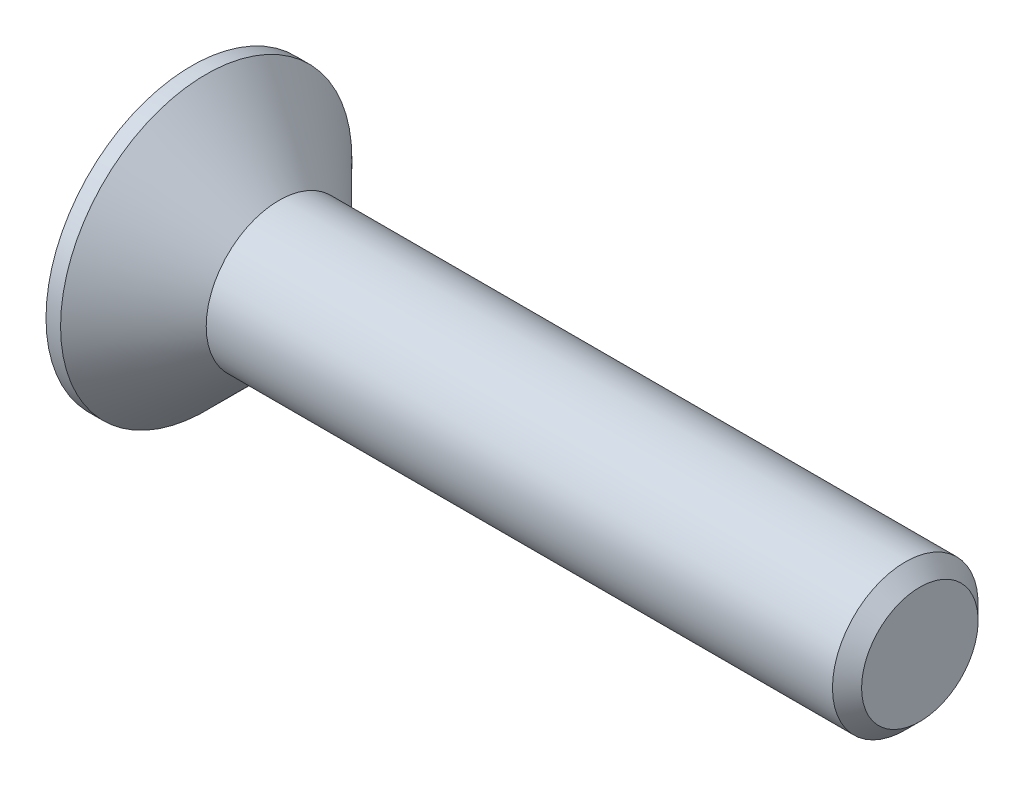
ISO-10303-21;
HEADER;
FILE_DESCRIPTION(('STEP AP214'),'2;1');
FILE_NAME('part.step','',(''),(''),'','','');
FILE_SCHEMA(('AUTOMOTIVE_DESIGN { 1 0 10303 214 1 1 1 1 }'));
ENDSEC;
DATA;
#1=APPLICATION_CONTEXT('core data for automotive mechanical design processes');
#2=APPLICATION_PROTOCOL_DEFINITION('international standard','automotive_design',2000,#1);
#3=PRODUCT_CONTEXT('',#1,'mechanical');
#4=PRODUCT('Part','Part','',(#3));
#5=PRODUCT_RELATED_PRODUCT_CATEGORY('part','',(#4));
#6=PRODUCT_DEFINITION_FORMATION('','',#4);
#7=PRODUCT_DEFINITION_CONTEXT('part definition',#1,'design');
#8=PRODUCT_DEFINITION('design','',#6,#7);
#9=PRODUCT_DEFINITION_SHAPE('','',#8);
#10=(LENGTH_UNIT() NAMED_UNIT(*) SI_UNIT(.MILLI.,.METRE.));
#11=(NAMED_UNIT(*) PLANE_ANGLE_UNIT() SI_UNIT($,.RADIAN.));
#12=(NAMED_UNIT(*) SI_UNIT($,.STERADIAN.) SOLID_ANGLE_UNIT());
#13=UNCERTAINTY_MEASURE_WITH_UNIT(LENGTH_MEASURE(1.E-05),#10,'distance_accuracy_value','');
#14=(GEOMETRIC_REPRESENTATION_CONTEXT(3) GLOBAL_UNCERTAINTY_ASSIGNED_CONTEXT((#13)) GLOBAL_UNIT_ASSIGNED_CONTEXT((#10,
#11,#12)) REPRESENTATION_CONTEXT('',''));
#15=CARTESIAN_POINT('',(0.,0.,0.));
#16=DIRECTION('',(0.,0.,1.));
#17=DIRECTION('',(1.,0.,0.));
#18=AXIS2_PLACEMENT_3D('',#15,#16,#17);
#19=CARTESIAN_POINT('',(-1.2,0.,0.));
#20=DIRECTION('',(-1.,0.,0.));
#21=DIRECTION('',(0.,0.,1.));
#22=AXIS2_PLACEMENT_3D('',#19,#20,#21);
#23=CYLINDRICAL_SURFACE('',#22,1.);
#24=CARTESIAN_POINT('',(8.6,0.,0.));
#25=DIRECTION('',(-1.,0.,0.));
#26=DIRECTION('',(0.,0.,1.));
#27=AXIS2_PLACEMENT_3D('',#24,#25,#26);
#28=CIRCLE('',#27,1.);
#29=CARTESIAN_POINT('',(8.6,0.,1.));
#30=VERTEX_POINT('',#29);
#31=EDGE_CURVE('E45',#30,#30,#28,.T.);
#32=ORIENTED_EDGE('',*,*,#31,.T.);
#33=EDGE_LOOP('',(#32));
#34=FACE_BOUND('',#33,.T.);
#35=CARTESIAN_POINT('',(0.,0.,0.));
#36=DIRECTION('',(-1.,0.,0.));
#37=DIRECTION('',(0.,0.,1.));
#38=AXIS2_PLACEMENT_3D('',#35,#36,#37);
#39=CIRCLE('',#38,1.);
#40=CARTESIAN_POINT('',(0.,0.,1.));
#41=VERTEX_POINT('',#40);
#42=EDGE_CURVE('E150',#41,#41,#39,.T.);
#43=ORIENTED_EDGE('',*,*,#42,.F.);
#44=EDGE_LOOP('',(#43));
#45=FACE_BOUND('',#44,.T.);
#46=ADVANCED_FACE('F37',(#34,#45),#23,.T.);
#47=CARTESIAN_POINT('',(0.,0.,0.));
#48=DIRECTION('',(-1.,0.,0.));
#49=DIRECTION('',(0.,0.,1.));
#50=AXIS2_PLACEMENT_3D('',#47,#48,#49);
#51=CONICAL_SURFACE('',#50,1.,0.785398163397444);
#52=CARTESIAN_POINT('',(-1.00000000000001,0.,0.));
#53=DIRECTION('',(-1.,0.,0.));
#54=DIRECTION('',(0.,0.,1.));
#55=AXIS2_PLACEMENT_3D('',#52,#53,#54);
#56=CIRCLE('',#55,2.);
#57=CARTESIAN_POINT('',(-1.00000000000001,0.,2.));
#58=VERTEX_POINT('',#57);
#59=EDGE_CURVE('E147',#58,#58,#56,.T.);
#60=ORIENTED_EDGE('',*,*,#59,.F.);
#61=EDGE_LOOP('',(#60));
#62=FACE_BOUND('',#61,.T.);
#63=ORIENTED_EDGE('',*,*,#42,.T.);
#64=EDGE_LOOP('',(#63));
#65=FACE_BOUND('',#64,.T.);
#66=ADVANCED_FACE('F172',(#62,#65),#51,.T.);
#67=CARTESIAN_POINT('',(-1.2,0.,0.));
#68=DIRECTION('',(-1.,0.,0.));
#69=DIRECTION('',(0.,0.,1.));
#70=AXIS2_PLACEMENT_3D('',#67,#68,#69);
#71=CYLINDRICAL_SURFACE('',#70,2.);
#72=CARTESIAN_POINT('',(-1.2,0.,0.));
#73=DIRECTION('',(-1.,0.,0.));
#74=DIRECTION('',(0.,0.,1.));
#75=AXIS2_PLACEMENT_3D('',#72,#73,#74);
#76=CIRCLE('',#75,2.);
#77=CARTESIAN_POINT('',(-1.2,0.,2.));
#78=VERTEX_POINT('',#77);
#79=EDGE_CURVE('E139',#78,#78,#76,.T.);
#80=ORIENTED_EDGE('',*,*,#79,.F.);
#81=EDGE_LOOP('',(#80));
#82=FACE_BOUND('',#81,.T.);
#83=ORIENTED_EDGE('',*,*,#59,.T.);
#84=EDGE_LOOP('',(#83));
#85=FACE_BOUND('',#84,.T.);
#86=ADVANCED_FACE('F176',(#82,#85),#71,.T.);
#87=CARTESIAN_POINT('',(-1.2,2.,0.));
#88=DIRECTION('',(1.,0.,0.));
#89=DIRECTION('',(0.,0.,-1.));
#90=AXIS2_PLACEMENT_3D('',#87,#88,#89);
#91=PLANE('',#90);
#92=DIRECTION('',(0.,-0.866025403784439,0.5));
#93=VECTOR('',#92,1.);
#94=CARTESIAN_POINT('',(-1.2,0.,-0.750555349946514));
#95=LINE('',#94,#93);
#96=CARTESIAN_POINT('',(-1.2,0.,-0.750555349946513));
#97=VERTEX_POINT('',#96);
#98=CARTESIAN_POINT('',(-1.2,-0.65,-0.375277674973257));
#99=VERTEX_POINT('',#98);
#100=EDGE_CURVE('E126',#97,#99,#95,.T.);
#101=ORIENTED_EDGE('',*,*,#100,.F.);
#102=DIRECTION('',(0.,-0.866025403784438,-0.5));
#103=VECTOR('',#102,1.);
#104=CARTESIAN_POINT('',(-1.2,0.65,-0.375277674973257));
#105=LINE('',#104,#103);
#106=CARTESIAN_POINT('',(-1.2,0.65,-0.375277674973257));
#107=VERTEX_POINT('',#106);
#108=EDGE_CURVE('E52',#107,#97,#105,.T.);
#109=ORIENTED_EDGE('',*,*,#108,.F.);
#110=DIRECTION('',(0.,0.,-1.));
#111=VECTOR('',#110,1.);
#112=CARTESIAN_POINT('',(-1.2,0.65,0.375277674973257));
#113=LINE('',#112,#111);
#114=CARTESIAN_POINT('',(-1.2,0.65,0.375277674973257));
#115=VERTEX_POINT('',#114);
#116=EDGE_CURVE('E135',#115,#107,#113,.T.);
#117=ORIENTED_EDGE('',*,*,#116,.F.);
#118=DIRECTION('',(0.,0.866025403784439,-0.5));
#119=VECTOR('',#118,1.);
#120=CARTESIAN_POINT('',(-1.2,0.,0.750555349946513));
#121=LINE('',#120,#119);
#122=CARTESIAN_POINT('',(-1.2,0.,0.750555349946513));
#123=VERTEX_POINT('',#122);
#124=EDGE_CURVE('E133',#123,#115,#121,.T.);
#125=ORIENTED_EDGE('',*,*,#124,.F.);
#126=DIRECTION('',(0.,0.866025403784439,0.5));
#127=VECTOR('',#126,1.);
#128=CARTESIAN_POINT('',(-1.2,-0.65,0.375277674973257));
#129=LINE('',#128,#127);
#130=CARTESIAN_POINT('',(-1.2,-0.65,0.375277674973257));
#131=VERTEX_POINT('',#130);
#132=EDGE_CURVE('E100',#131,#123,#129,.T.);
#133=ORIENTED_EDGE('',*,*,#132,.F.);
#134=DIRECTION('',(0.,0.,1.));
#135=VECTOR('',#134,1.);
#136=CARTESIAN_POINT('',(-1.2,-0.65,-0.375277674973257));
#137=LINE('',#136,#135);
#138=EDGE_CURVE('E129',#99,#131,#137,.T.);
#139=ORIENTED_EDGE('',*,*,#138,.F.);
#140=EDGE_LOOP('',(#101,#109,#117,#125,#133,#139));
#141=FACE_BOUND('',#140,.T.);
#142=ORIENTED_EDGE('',*,*,#79,.T.);
#143=EDGE_LOOP('',(#142));
#144=FACE_BOUND('',#143,.T.);
#145=ADVANCED_FACE('F167',(#141,#144),#91,.F.);
#146=CARTESIAN_POINT('',(8.8,0.,0.));
#147=DIRECTION('',(-1.,0.,0.));
#148=DIRECTION('',(0.,0.,1.));
#149=AXIS2_PLACEMENT_3D('',#146,#147,#148);
#150=PLANE('',#149);
#151=CARTESIAN_POINT('',(8.8,0.,0.));
#152=DIRECTION('',(-1.,0.,0.));
#153=DIRECTION('',(0.,0.,1.));
#154=AXIS2_PLACEMENT_3D('',#151,#152,#153);
#155=CIRCLE('',#154,0.799999999999999);
#156=CARTESIAN_POINT('',(8.8,0.,0.799999999999999));
#157=VERTEX_POINT('',#156);
#158=EDGE_CURVE('E11',#157,#157,#155,.F.);
#159=ORIENTED_EDGE('',*,*,#158,.T.);
#160=EDGE_LOOP('',(#159));
#161=FACE_BOUND('',#160,.T.);
#162=ADVANCED_FACE('F159',(#161),#150,.F.);
#163=CARTESIAN_POINT('',(8.6,0.,0.));
#164=DIRECTION('',(-1.,0.,0.));
#165=DIRECTION('',(0.,0.,1.));
#166=AXIS2_PLACEMENT_3D('',#163,#164,#165);
#167=CONICAL_SURFACE('',#166,1.,0.785398163397448);
#168=ORIENTED_EDGE('',*,*,#158,.F.);
#169=EDGE_LOOP('',(#168));
#170=FACE_BOUND('',#169,.T.);
#171=ORIENTED_EDGE('',*,*,#31,.F.);
#172=EDGE_LOOP('',(#171));
#173=FACE_BOUND('',#172,.T.);
#174=ADVANCED_FACE('F39',(#170,#173),#167,.T.);
#175=CARTESIAN_POINT('',(-0.45,0.65,-0.375277674973257));
#176=DIRECTION('',(0.,0.5,-0.866025403784439));
#177=DIRECTION('',(0.,0.866025403784439,0.5));
#178=AXIS2_PLACEMENT_3D('',#175,#176,#177);
#179=PLANE('',#178);
#180=ORIENTED_EDGE('',*,*,#108,.T.);
#181=DIRECTION('',(-1.,0.,0.));
#182=VECTOR('',#181,1.);
#183=CARTESIAN_POINT('',(-0.45,0.,-0.750555349946514));
#184=LINE('',#183,#182);
#185=CARTESIAN_POINT('',(-0.45,0.,-0.750555349946514));
#186=VERTEX_POINT('',#185);
#187=EDGE_CURVE('E82',#186,#97,#184,.T.);
#188=ORIENTED_EDGE('',*,*,#187,.F.);
#189=DIRECTION('',(0.,-0.866025403784438,-0.5));
#190=VECTOR('',#189,1.);
#191=CARTESIAN_POINT('',(-0.45,0.65,-0.375277674973257));
#192=LINE('',#191,#190);
#193=CARTESIAN_POINT('',(-0.45,0.65,-0.375277674973257));
#194=VERTEX_POINT('',#193);
#195=EDGE_CURVE('E137',#194,#186,#192,.T.);
#196=ORIENTED_EDGE('',*,*,#195,.F.);
#197=DIRECTION('',(-1.,0.,0.));
#198=VECTOR('',#197,1.);
#199=CARTESIAN_POINT('',(-0.45,0.65,-0.375277674973257));
#200=LINE('',#199,#198);
#201=EDGE_CURVE('E60',#194,#107,#200,.T.);
#202=ORIENTED_EDGE('',*,*,#201,.T.);
#203=EDGE_LOOP('',(#180,#188,#196,#202));
#204=FACE_BOUND('',#203,.T.);
#205=ADVANCED_FACE('F158',(#204),#179,.F.);
#206=CARTESIAN_POINT('',(-0.45,0.65,0.375277674973257));
#207=DIRECTION('',(0.,1.,0.));
#208=DIRECTION('',(0.,0.,1.));
#209=AXIS2_PLACEMENT_3D('',#206,#207,#208);
#210=PLANE('',#209);
#211=ORIENTED_EDGE('',*,*,#116,.T.);
#212=ORIENTED_EDGE('',*,*,#201,.F.);
#213=DIRECTION('',(0.,0.,-1.));
#214=VECTOR('',#213,1.);
#215=CARTESIAN_POINT('',(-0.45,0.65,0.375277674973257));
#216=LINE('',#215,#214);
#217=CARTESIAN_POINT('',(-0.45,0.65,0.375277674973257));
#218=VERTEX_POINT('',#217);
#219=EDGE_CURVE('E112',#218,#194,#216,.T.);
#220=ORIENTED_EDGE('',*,*,#219,.F.);
#221=DIRECTION('',(-1.,0.,0.));
#222=VECTOR('',#221,1.);
#223=CARTESIAN_POINT('',(-0.45,0.65,0.375277674973257));
#224=LINE('',#223,#222);
#225=EDGE_CURVE('E104',#218,#115,#224,.T.);
#226=ORIENTED_EDGE('',*,*,#225,.T.);
#227=EDGE_LOOP('',(#211,#212,#220,#226));
#228=FACE_BOUND('',#227,.T.);
#229=ADVANCED_FACE('F165',(#228),#210,.F.);
#230=CARTESIAN_POINT('',(-0.45,0.,0.750555349946513));
#231=DIRECTION('',(0.,0.5,0.866025403784439));
#232=DIRECTION('',(0.,-0.866025403784439,0.5));
#233=AXIS2_PLACEMENT_3D('',#230,#231,#232);
#234=PLANE('',#233);
#235=ORIENTED_EDGE('',*,*,#124,.T.);
#236=ORIENTED_EDGE('',*,*,#225,.F.);
#237=DIRECTION('',(0.,0.866025403784439,-0.5));
#238=VECTOR('',#237,1.);
#239=CARTESIAN_POINT('',(-0.45,0.,0.750555349946513));
#240=LINE('',#239,#238);
#241=CARTESIAN_POINT('',(-0.45,0.,0.750555349946513));
#242=VERTEX_POINT('',#241);
#243=EDGE_CURVE('E108',#242,#218,#240,.T.);
#244=ORIENTED_EDGE('',*,*,#243,.F.);
#245=DIRECTION('',(-1.,0.,0.));
#246=VECTOR('',#245,1.);
#247=CARTESIAN_POINT('',(-0.45,0.,0.750555349946513));
#248=LINE('',#247,#246);
#249=EDGE_CURVE('E93',#242,#123,#248,.T.);
#250=ORIENTED_EDGE('',*,*,#249,.T.);
#251=EDGE_LOOP('',(#235,#236,#244,#250));
#252=FACE_BOUND('',#251,.T.);
#253=ADVANCED_FACE('F109',(#252),#234,.F.);
#254=CARTESIAN_POINT('',(-0.45,-0.65,0.375277674973257));
#255=DIRECTION('',(0.,-0.5,0.866025403784439));
#256=DIRECTION('',(0.,-0.866025403784439,-0.5));
#257=AXIS2_PLACEMENT_3D('',#254,#255,#256);
#258=PLANE('',#257);
#259=ORIENTED_EDGE('',*,*,#132,.T.);
#260=ORIENTED_EDGE('',*,*,#249,.F.);
#261=DIRECTION('',(0.,0.866025403784439,0.5));
#262=VECTOR('',#261,1.);
#263=CARTESIAN_POINT('',(-0.45,-0.65,0.375277674973257));
#264=LINE('',#263,#262);
#265=CARTESIAN_POINT('',(-0.45,-0.65,0.375277674973257));
#266=VERTEX_POINT('',#265);
#267=EDGE_CURVE('E97',#266,#242,#264,.T.);
#268=ORIENTED_EDGE('',*,*,#267,.F.);
#269=DIRECTION('',(-1.,0.,0.));
#270=VECTOR('',#269,1.);
#271=CARTESIAN_POINT('',(-0.45,-0.65,0.375277674973257));
#272=LINE('',#271,#270);
#273=EDGE_CURVE('E105',#266,#131,#272,.T.);
#274=ORIENTED_EDGE('',*,*,#273,.T.);
#275=EDGE_LOOP('',(#259,#260,#268,#274));
#276=FACE_BOUND('',#275,.T.);
#277=ADVANCED_FACE('F95',(#276),#258,.F.);
#278=CARTESIAN_POINT('',(-0.45,-0.65,-0.375277674973257));
#279=DIRECTION('',(0.,-1.,0.));
#280=DIRECTION('',(0.,0.,-1.));
#281=AXIS2_PLACEMENT_3D('',#278,#279,#280);
#282=PLANE('',#281);
#283=ORIENTED_EDGE('',*,*,#138,.T.);
#284=ORIENTED_EDGE('',*,*,#273,.F.);
#285=DIRECTION('',(0.,0.,1.));
#286=VECTOR('',#285,1.);
#287=CARTESIAN_POINT('',(-0.45,-0.65,-0.375277674973257));
#288=LINE('',#287,#286);
#289=CARTESIAN_POINT('',(-0.45,-0.65,-0.375277674973257));
#290=VERTEX_POINT('',#289);
#291=EDGE_CURVE('E118',#290,#266,#288,.T.);
#292=ORIENTED_EDGE('',*,*,#291,.F.);
#293=DIRECTION('',(-1.,0.,0.));
#294=VECTOR('',#293,1.);
#295=CARTESIAN_POINT('',(-0.45,-0.65,-0.375277674973257));
#296=LINE('',#295,#294);
#297=EDGE_CURVE('E142',#290,#99,#296,.T.);
#298=ORIENTED_EDGE('',*,*,#297,.T.);
#299=EDGE_LOOP('',(#283,#284,#292,#298));
#300=FACE_BOUND('',#299,.T.);
#301=ADVANCED_FACE('F189',(#300),#282,.F.);
#302=CARTESIAN_POINT('',(-0.45,0.,-0.750555349946514));
#303=DIRECTION('',(0.,-0.5,-0.866025403784439));
#304=DIRECTION('',(0.,0.866025403784439,-0.5));
#305=AXIS2_PLACEMENT_3D('',#302,#303,#304);
#306=PLANE('',#305);
#307=ORIENTED_EDGE('',*,*,#100,.T.);
#308=ORIENTED_EDGE('',*,*,#297,.F.);
#309=DIRECTION('',(0.,-0.866025403784439,0.5));
#310=VECTOR('',#309,1.);
#311=CARTESIAN_POINT('',(-0.45,0.,-0.750555349946514));
#312=LINE('',#311,#310);
#313=EDGE_CURVE('E120',#186,#290,#312,.T.);
#314=ORIENTED_EDGE('',*,*,#313,.F.);
#315=ORIENTED_EDGE('',*,*,#187,.T.);
#316=EDGE_LOOP('',(#307,#308,#314,#315));
#317=FACE_BOUND('',#316,.T.);
#318=ADVANCED_FACE('F186',(#317),#306,.F.);
#319=CARTESIAN_POINT('',(-0.45,0.,0.));
#320=DIRECTION('',(-1.,0.,0.));
#321=DIRECTION('',(0.,0.,1.));
#322=AXIS2_PLACEMENT_3D('',#319,#320,#321);
#323=PLANE('',#322);
#324=ORIENTED_EDGE('',*,*,#195,.T.);
#325=ORIENTED_EDGE('',*,*,#313,.T.);
#326=ORIENTED_EDGE('',*,*,#291,.T.);
#327=ORIENTED_EDGE('',*,*,#267,.T.);
#328=ORIENTED_EDGE('',*,*,#243,.T.);
#329=ORIENTED_EDGE('',*,*,#219,.T.);
#330=EDGE_LOOP('',(#324,#325,#326,#327,#328,#329));
#331=FACE_BOUND('',#330,.T.);
#332=ADVANCED_FACE('F115',(#331),#323,.T.);
#333=CLOSED_SHELL('',(#46,#66,#86,#145,#162,#174,#205,#229,#253,#277,#301,#318,#332));
#334=MANIFOLD_SOLID_BREP('B2',#333);
#335=ADVANCED_BREP_SHAPE_REPRESENTATION('',(#18,#334),#14);
#336=SHAPE_DEFINITION_REPRESENTATION(#9,#335);
ENDSEC;
END-ISO-10303-21;
